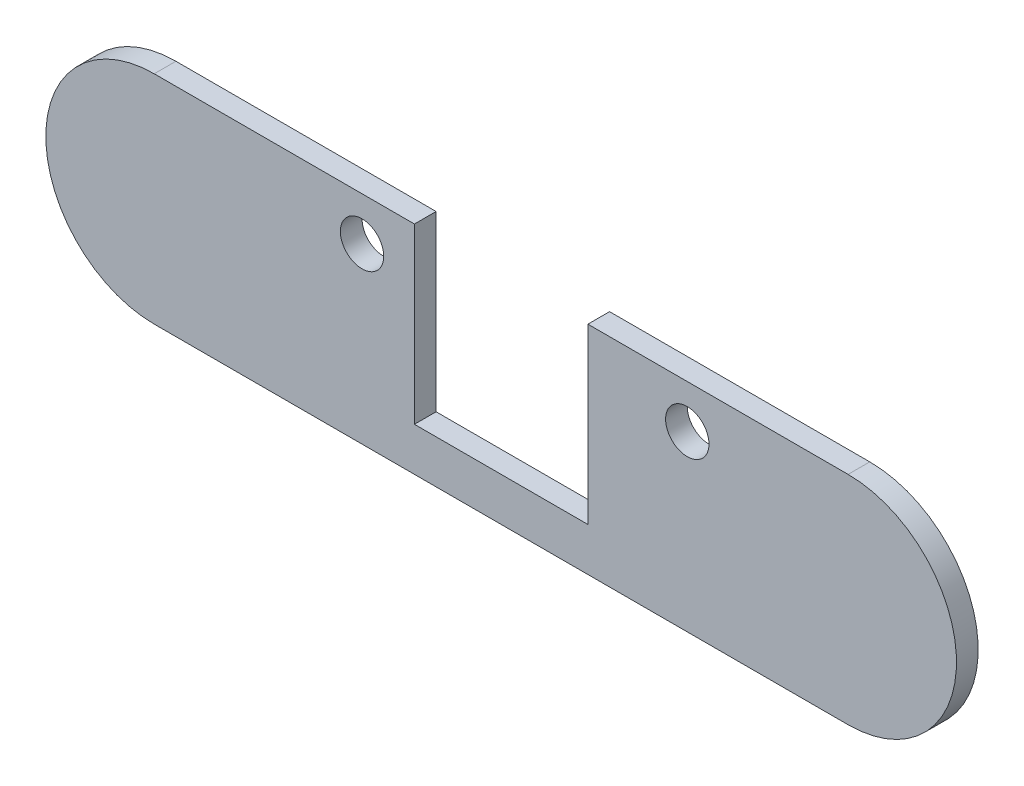
ISO-10303-21;
HEADER;
FILE_DESCRIPTION(('STEP AP214'),'2;1');
FILE_NAME('part.step','',(''),(''),'','','');
FILE_SCHEMA(('AUTOMOTIVE_DESIGN { 1 0 10303 214 1 1 1 1 }'));
ENDSEC;
DATA;
#1=APPLICATION_CONTEXT('core data for automotive mechanical design processes');
#2=APPLICATION_PROTOCOL_DEFINITION('international standard','automotive_design',2000,#1);
#3=PRODUCT_CONTEXT('',#1,'mechanical');
#4=PRODUCT('Part','Part','',(#3));
#5=PRODUCT_RELATED_PRODUCT_CATEGORY('part','',(#4));
#6=PRODUCT_DEFINITION_FORMATION('','',#4);
#7=PRODUCT_DEFINITION_CONTEXT('part definition',#1,'design');
#8=PRODUCT_DEFINITION('design','',#6,#7);
#9=PRODUCT_DEFINITION_SHAPE('','',#8);
#10=(LENGTH_UNIT() NAMED_UNIT(*) SI_UNIT(.MILLI.,.METRE.));
#11=(NAMED_UNIT(*) PLANE_ANGLE_UNIT() SI_UNIT($,.RADIAN.));
#12=(NAMED_UNIT(*) SI_UNIT($,.STERADIAN.) SOLID_ANGLE_UNIT());
#13=UNCERTAINTY_MEASURE_WITH_UNIT(LENGTH_MEASURE(1.E-05),#10,'distance_accuracy_value','');
#14=(GEOMETRIC_REPRESENTATION_CONTEXT(3) GLOBAL_UNCERTAINTY_ASSIGNED_CONTEXT((#13)) GLOBAL_UNIT_ASSIGNED_CONTEXT((#10,
#11,#12)) REPRESENTATION_CONTEXT('',''));
#15=CARTESIAN_POINT('',(0.,0.,0.));
#16=DIRECTION('',(0.,0.,1.));
#17=DIRECTION('',(1.,0.,0.));
#18=AXIS2_PLACEMENT_3D('',#15,#16,#17);
#19=CARTESIAN_POINT('',(0.,25.,5.));
#20=DIRECTION('',(0.,-1.,0.));
#21=DIRECTION('',(0.,0.,-1.));
#22=AXIS2_PLACEMENT_3D('',#19,#20,#21);
#23=PLANE('',#22);
#24=DIRECTION('',(-1.,0.,0.));
#25=VECTOR('',#24,1.);
#26=CARTESIAN_POINT('',(0.,25.,0.));
#27=LINE('',#26,#25);
#28=CARTESIAN_POINT('',(160.,25.,0.));
#29=VERTEX_POINT('',#28);
#30=CARTESIAN_POINT('',(100.,25.,0.));
#31=VERTEX_POINT('',#30);
#32=EDGE_CURVE('E153',#29,#31,#27,.T.);
#33=ORIENTED_EDGE('',*,*,#32,.T.);
#34=DIRECTION('',(0.,0.,1.));
#35=VECTOR('',#34,1.);
#36=CARTESIAN_POINT('',(100.,25.,0.));
#37=LINE('',#36,#35);
#38=CARTESIAN_POINT('',(100.,25.,5.));
#39=VERTEX_POINT('',#38);
#40=EDGE_CURVE('E133',#31,#39,#37,.T.);
#41=ORIENTED_EDGE('',*,*,#40,.T.);
#42=DIRECTION('',(-1.,0.,0.));
#43=VECTOR('',#42,1.);
#44=CARTESIAN_POINT('',(0.,25.,5.));
#45=LINE('',#44,#43);
#46=CARTESIAN_POINT('',(160.,25.,5.));
#47=VERTEX_POINT('',#46);
#48=EDGE_CURVE('E157',#47,#39,#45,.T.);
#49=ORIENTED_EDGE('',*,*,#48,.F.);
#50=DIRECTION('',(0.,0.,-1.));
#51=VECTOR('',#50,1.);
#52=CARTESIAN_POINT('',(160.,25.,5.));
#53=LINE('',#52,#51);
#54=EDGE_CURVE('E170',#47,#29,#53,.T.);
#55=ORIENTED_EDGE('',*,*,#54,.T.);
#56=EDGE_LOOP('',(#33,#41,#49,#55));
#57=FACE_BOUND('',#56,.T.);
#58=ADVANCED_FACE('F32',(#57),#23,.F.);
#59=CARTESIAN_POINT('',(0.,0.,5.));
#60=DIRECTION('',(0.,0.,1.));
#61=DIRECTION('',(1.,0.,0.));
#62=AXIS2_PLACEMENT_3D('',#59,#60,#61);
#63=PLANE('',#62);
#64=DIRECTION('',(0.,1.,0.));
#65=VECTOR('',#64,1.);
#66=CARTESIAN_POINT('',(100.,-15.,5.));
#67=LINE('',#66,#65);
#68=CARTESIAN_POINT('',(100.,-15.,5.));
#69=VERTEX_POINT('',#68);
#70=EDGE_CURVE('E125',#69,#39,#67,.T.);
#71=ORIENTED_EDGE('',*,*,#70,.F.);
#72=DIRECTION('',(1.,0.,0.));
#73=VECTOR('',#72,1.);
#74=CARTESIAN_POINT('',(60.,-15.,5.));
#75=LINE('',#74,#73);
#76=CARTESIAN_POINT('',(60.,-15.,5.));
#77=VERTEX_POINT('',#76);
#78=EDGE_CURVE('E127',#77,#69,#75,.T.);
#79=ORIENTED_EDGE('',*,*,#78,.F.);
#80=DIRECTION('',(0.,-1.,0.));
#81=VECTOR('',#80,1.);
#82=CARTESIAN_POINT('',(60.,25.,5.));
#83=LINE('',#82,#81);
#84=CARTESIAN_POINT('',(60.,25.,5.));
#85=VERTEX_POINT('',#84);
#86=EDGE_CURVE('E107',#85,#77,#83,.T.);
#87=ORIENTED_EDGE('',*,*,#86,.F.);
#88=CARTESIAN_POINT('',(0.,25.,5.));
#89=VERTEX_POINT('',#88);
#90=EDGE_CURVE('E56',#85,#89,#45,.T.);
#91=ORIENTED_EDGE('',*,*,#90,.T.);
#92=CARTESIAN_POINT('',(0.,0.,5.));
#93=DIRECTION('',(0.,0.,1.));
#94=DIRECTION('',(1.,0.,0.));
#95=AXIS2_PLACEMENT_3D('',#92,#93,#94);
#96=CIRCLE('',#95,25.);
#97=CARTESIAN_POINT('',(0.,-25.,5.));
#98=VERTEX_POINT('',#97);
#99=EDGE_CURVE('E151',#89,#98,#96,.T.);
#100=ORIENTED_EDGE('',*,*,#99,.T.);
#101=DIRECTION('',(1.,0.,0.));
#102=VECTOR('',#101,1.);
#103=CARTESIAN_POINT('',(0.,-25.,5.));
#104=LINE('',#103,#102);
#105=CARTESIAN_POINT('',(160.,-25.,5.));
#106=VERTEX_POINT('',#105);
#107=EDGE_CURVE('E84',#98,#106,#104,.T.);
#108=ORIENTED_EDGE('',*,*,#107,.T.);
#109=CARTESIAN_POINT('',(160.,0.,5.));
#110=DIRECTION('',(0.,0.,1.));
#111=DIRECTION('',(1.,0.,0.));
#112=AXIS2_PLACEMENT_3D('',#109,#110,#111);
#113=CIRCLE('',#112,25.);
#114=EDGE_CURVE('E155',#106,#47,#113,.T.);
#115=ORIENTED_EDGE('',*,*,#114,.T.);
#116=ORIENTED_EDGE('',*,*,#48,.T.);
#117=EDGE_LOOP('',(#71,#79,#87,#91,#100,#108,#115,#116));
#118=FACE_BOUND('',#117,.T.);
#119=CARTESIAN_POINT('',(122.919007564522,15.,5.));
#120=DIRECTION('',(0.,0.,1.));
#121=DIRECTION('',(1.,0.,0.));
#122=AXIS2_PLACEMENT_3D('',#119,#120,#121);
#123=CIRCLE('',#122,5.);
#124=CARTESIAN_POINT('',(127.919007564522,15.,5.));
#125=VERTEX_POINT('',#124);
#126=EDGE_CURVE('E145',#125,#125,#123,.T.);
#127=ORIENTED_EDGE('',*,*,#126,.F.);
#128=EDGE_LOOP('',(#127));
#129=FACE_BOUND('',#128,.T.);
#130=CARTESIAN_POINT('',(47.9190075645217,15.,5.));
#131=DIRECTION('',(0.,0.,1.));
#132=DIRECTION('',(1.,0.,0.));
#133=AXIS2_PLACEMENT_3D('',#130,#131,#132);
#134=CIRCLE('',#133,5.);
#135=CARTESIAN_POINT('',(52.9190075645217,15.,5.));
#136=VERTEX_POINT('',#135);
#137=EDGE_CURVE('E139',#136,#136,#134,.T.);
#138=ORIENTED_EDGE('',*,*,#137,.F.);
#139=EDGE_LOOP('',(#138));
#140=FACE_BOUND('',#139,.T.);
#141=ADVANCED_FACE('F182',(#118,#129,#140),#63,.T.);
#142=CARTESIAN_POINT('',(0.,0.,0.));
#143=DIRECTION('',(0.,0.,1.));
#144=DIRECTION('',(1.,0.,0.));
#145=AXIS2_PLACEMENT_3D('',#142,#143,#144);
#146=PLANE('',#145);
#147=DIRECTION('',(1.,0.,0.));
#148=VECTOR('',#147,1.);
#149=CARTESIAN_POINT('',(60.,-15.,0.));
#150=LINE('',#149,#148);
#151=CARTESIAN_POINT('',(60.,-15.,0.));
#152=VERTEX_POINT('',#151);
#153=CARTESIAN_POINT('',(100.,-15.,0.));
#154=VERTEX_POINT('',#153);
#155=EDGE_CURVE('E115',#152,#154,#150,.T.);
#156=ORIENTED_EDGE('',*,*,#155,.T.);
#157=DIRECTION('',(0.,1.,0.));
#158=VECTOR('',#157,1.);
#159=CARTESIAN_POINT('',(100.,-15.,0.));
#160=LINE('',#159,#158);
#161=EDGE_CURVE('E120',#154,#31,#160,.T.);
#162=ORIENTED_EDGE('',*,*,#161,.T.);
#163=ORIENTED_EDGE('',*,*,#32,.F.);
#164=CARTESIAN_POINT('',(160.,0.,0.));
#165=DIRECTION('',(0.,0.,1.));
#166=DIRECTION('',(1.,0.,0.));
#167=AXIS2_PLACEMENT_3D('',#164,#165,#166);
#168=CIRCLE('',#167,25.);
#169=CARTESIAN_POINT('',(160.,-25.,0.));
#170=VERTEX_POINT('',#169);
#171=EDGE_CURVE('E165',#170,#29,#168,.T.);
#172=ORIENTED_EDGE('',*,*,#171,.F.);
#173=DIRECTION('',(1.,0.,0.));
#174=VECTOR('',#173,1.);
#175=CARTESIAN_POINT('',(0.,-25.,0.));
#176=LINE('',#175,#174);
#177=CARTESIAN_POINT('',(0.,-25.,0.));
#178=VERTEX_POINT('',#177);
#179=EDGE_CURVE('E163',#178,#170,#176,.T.);
#180=ORIENTED_EDGE('',*,*,#179,.F.);
#181=CARTESIAN_POINT('',(0.,0.,0.));
#182=DIRECTION('',(0.,0.,1.));
#183=DIRECTION('',(1.,0.,0.));
#184=AXIS2_PLACEMENT_3D('',#181,#182,#183);
#185=CIRCLE('',#184,25.);
#186=CARTESIAN_POINT('',(0.,25.,0.));
#187=VERTEX_POINT('',#186);
#188=EDGE_CURVE('E148',#187,#178,#185,.T.);
#189=ORIENTED_EDGE('',*,*,#188,.F.);
#190=CARTESIAN_POINT('',(60.,25.,0.));
#191=VERTEX_POINT('',#190);
#192=EDGE_CURVE('E77',#191,#187,#27,.T.);
#193=ORIENTED_EDGE('',*,*,#192,.F.);
#194=DIRECTION('',(0.,-1.,0.));
#195=VECTOR('',#194,1.);
#196=CARTESIAN_POINT('',(60.,25.,0.));
#197=LINE('',#196,#195);
#198=EDGE_CURVE('E47',#191,#152,#197,.T.);
#199=ORIENTED_EDGE('',*,*,#198,.T.);
#200=EDGE_LOOP('',(#156,#162,#163,#172,#180,#189,#193,#199));
#201=FACE_BOUND('',#200,.T.);
#202=CARTESIAN_POINT('',(122.919007564522,15.,0.));
#203=DIRECTION('',(0.,0.,1.));
#204=DIRECTION('',(1.,0.,0.));
#205=AXIS2_PLACEMENT_3D('',#202,#203,#204);
#206=CIRCLE('',#205,5.);
#207=CARTESIAN_POINT('',(127.919007564522,15.,0.));
#208=VERTEX_POINT('',#207);
#209=EDGE_CURVE('E142',#208,#208,#206,.T.);
#210=ORIENTED_EDGE('',*,*,#209,.T.);
#211=EDGE_LOOP('',(#210));
#212=FACE_BOUND('',#211,.T.);
#213=CARTESIAN_POINT('',(47.9190075645217,15.,0.));
#214=DIRECTION('',(0.,0.,1.));
#215=DIRECTION('',(1.,0.,0.));
#216=AXIS2_PLACEMENT_3D('',#213,#214,#215);
#217=CIRCLE('',#216,5.);
#218=CARTESIAN_POINT('',(52.9190075645217,15.,0.));
#219=VERTEX_POINT('',#218);
#220=EDGE_CURVE('E136',#219,#219,#217,.T.);
#221=ORIENTED_EDGE('',*,*,#220,.T.);
#222=EDGE_LOOP('',(#221));
#223=FACE_BOUND('',#222,.T.);
#224=ADVANCED_FACE('F122',(#201,#212,#223),#146,.F.);
#225=CARTESIAN_POINT('',(0.,0.,5.));
#226=DIRECTION('',(0.,0.,-1.));
#227=DIRECTION('',(-1.,0.,0.));
#228=AXIS2_PLACEMENT_3D('',#225,#226,#227);
#229=CYLINDRICAL_SURFACE('',#228,25.);
#230=ORIENTED_EDGE('',*,*,#188,.T.);
#231=DIRECTION('',(0.,0.,-1.));
#232=VECTOR('',#231,1.);
#233=CARTESIAN_POINT('',(0.,-25.,5.));
#234=LINE('',#233,#232);
#235=EDGE_CURVE('E11',#98,#178,#234,.T.);
#236=ORIENTED_EDGE('',*,*,#235,.F.);
#237=ORIENTED_EDGE('',*,*,#99,.F.);
#238=DIRECTION('',(0.,0.,-1.));
#239=VECTOR('',#238,1.);
#240=CARTESIAN_POINT('',(0.,25.,5.));
#241=LINE('',#240,#239);
#242=EDGE_CURVE('E160',#89,#187,#241,.T.);
#243=ORIENTED_EDGE('',*,*,#242,.T.);
#244=EDGE_LOOP('',(#230,#236,#237,#243));
#245=FACE_BOUND('',#244,.T.);
#246=ADVANCED_FACE('F34',(#245),#229,.T.);
#247=CARTESIAN_POINT('',(0.,-25.,5.));
#248=DIRECTION('',(0.,1.,0.));
#249=DIRECTION('',(0.,0.,1.));
#250=AXIS2_PLACEMENT_3D('',#247,#248,#249);
#251=PLANE('',#250);
#252=ORIENTED_EDGE('',*,*,#179,.T.);
#253=DIRECTION('',(0.,0.,-1.));
#254=VECTOR('',#253,1.);
#255=CARTESIAN_POINT('',(160.,-25.,5.));
#256=LINE('',#255,#254);
#257=EDGE_CURVE('E40',#106,#170,#256,.T.);
#258=ORIENTED_EDGE('',*,*,#257,.F.);
#259=ORIENTED_EDGE('',*,*,#107,.F.);
#260=ORIENTED_EDGE('',*,*,#235,.T.);
#261=EDGE_LOOP('',(#252,#258,#259,#260));
#262=FACE_BOUND('',#261,.T.);
#263=ADVANCED_FACE('F187',(#262),#251,.F.);
#264=CARTESIAN_POINT('',(160.,0.,5.));
#265=DIRECTION('',(0.,0.,-1.));
#266=DIRECTION('',(-1.,0.,0.));
#267=AXIS2_PLACEMENT_3D('',#264,#265,#266);
#268=CYLINDRICAL_SURFACE('',#267,25.);
#269=ORIENTED_EDGE('',*,*,#171,.T.);
#270=ORIENTED_EDGE('',*,*,#54,.F.);
#271=ORIENTED_EDGE('',*,*,#114,.F.);
#272=ORIENTED_EDGE('',*,*,#257,.T.);
#273=EDGE_LOOP('',(#269,#270,#271,#272));
#274=FACE_BOUND('',#273,.T.);
#275=ADVANCED_FACE('F176',(#274),#268,.T.);
#276=ORIENTED_EDGE('',*,*,#90,.F.);
#277=DIRECTION('',(0.,0.,1.));
#278=VECTOR('',#277,1.);
#279=CARTESIAN_POINT('',(60.,25.,0.));
#280=LINE('',#279,#278);
#281=EDGE_CURVE('E112',#191,#85,#280,.T.);
#282=ORIENTED_EDGE('',*,*,#281,.F.);
#283=ORIENTED_EDGE('',*,*,#192,.T.);
#284=ORIENTED_EDGE('',*,*,#242,.F.);
#285=EDGE_LOOP('',(#276,#282,#283,#284));
#286=FACE_BOUND('',#285,.T.);
#287=ADVANCED_FACE('F193',(#286),#23,.F.);
#288=CARTESIAN_POINT('',(122.919007564522,15.,5.));
#289=DIRECTION('',(0.,0.,-1.));
#290=DIRECTION('',(-1.,0.,0.));
#291=AXIS2_PLACEMENT_3D('',#288,#289,#290);
#292=CYLINDRICAL_SURFACE('',#291,5.);
#293=ORIENTED_EDGE('',*,*,#126,.T.);
#294=EDGE_LOOP('',(#293));
#295=FACE_BOUND('',#294,.T.);
#296=ORIENTED_EDGE('',*,*,#209,.F.);
#297=EDGE_LOOP('',(#296));
#298=FACE_BOUND('',#297,.T.);
#299=ADVANCED_FACE('F203',(#295,#298),#292,.F.);
#300=CARTESIAN_POINT('',(47.9190075645217,15.,5.));
#301=DIRECTION('',(0.,0.,-1.));
#302=DIRECTION('',(-1.,0.,0.));
#303=AXIS2_PLACEMENT_3D('',#300,#301,#302);
#304=CYLINDRICAL_SURFACE('',#303,5.);
#305=ORIENTED_EDGE('',*,*,#137,.T.);
#306=EDGE_LOOP('',(#305));
#307=FACE_BOUND('',#306,.T.);
#308=ORIENTED_EDGE('',*,*,#220,.F.);
#309=EDGE_LOOP('',(#308));
#310=FACE_BOUND('',#309,.T.);
#311=ADVANCED_FACE('F207',(#307,#310),#304,.F.);
#312=CARTESIAN_POINT('',(100.,-15.,0.));
#313=DIRECTION('',(1.,0.,0.));
#314=DIRECTION('',(0.,0.,-1.));
#315=AXIS2_PLACEMENT_3D('',#312,#313,#314);
#316=PLANE('',#315);
#317=ORIENTED_EDGE('',*,*,#70,.T.);
#318=ORIENTED_EDGE('',*,*,#40,.F.);
#319=ORIENTED_EDGE('',*,*,#161,.F.);
#320=DIRECTION('',(0.,0.,1.));
#321=VECTOR('',#320,1.);
#322=CARTESIAN_POINT('',(100.,-15.,0.));
#323=LINE('',#322,#321);
#324=EDGE_CURVE('E111',#154,#69,#323,.T.);
#325=ORIENTED_EDGE('',*,*,#324,.T.);
#326=EDGE_LOOP('',(#317,#318,#319,#325));
#327=FACE_BOUND('',#326,.T.);
#328=ADVANCED_FACE('F213',(#327),#316,.F.);
#329=CARTESIAN_POINT('',(60.,-15.,0.));
#330=DIRECTION('',(0.,-1.,0.));
#331=DIRECTION('',(0.,0.,-1.));
#332=AXIS2_PLACEMENT_3D('',#329,#330,#331);
#333=PLANE('',#332);
#334=ORIENTED_EDGE('',*,*,#78,.T.);
#335=ORIENTED_EDGE('',*,*,#324,.F.);
#336=ORIENTED_EDGE('',*,*,#155,.F.);
#337=DIRECTION('',(0.,0.,1.));
#338=VECTOR('',#337,1.);
#339=CARTESIAN_POINT('',(60.,-15.,0.));
#340=LINE('',#339,#338);
#341=EDGE_CURVE('E104',#152,#77,#340,.T.);
#342=ORIENTED_EDGE('',*,*,#341,.T.);
#343=EDGE_LOOP('',(#334,#335,#336,#342));
#344=FACE_BOUND('',#343,.T.);
#345=ADVANCED_FACE('F116',(#344),#333,.F.);
#346=CARTESIAN_POINT('',(60.,25.,0.));
#347=DIRECTION('',(-1.,0.,0.));
#348=DIRECTION('',(0.,-1.,0.));
#349=AXIS2_PLACEMENT_3D('',#346,#347,#348);
#350=PLANE('',#349);
#351=ORIENTED_EDGE('',*,*,#86,.T.);
#352=ORIENTED_EDGE('',*,*,#341,.F.);
#353=ORIENTED_EDGE('',*,*,#198,.F.);
#354=ORIENTED_EDGE('',*,*,#281,.T.);
#355=EDGE_LOOP('',(#351,#352,#353,#354));
#356=FACE_BOUND('',#355,.T.);
#357=ADVANCED_FACE('F106',(#356),#350,.F.);
#358=CLOSED_SHELL('',(#58,#141,#224,#246,#263,#275,#287,#299,#311,#328,#345,#357));
#359=MANIFOLD_SOLID_BREP('B2',#358);
#360=ADVANCED_BREP_SHAPE_REPRESENTATION('',(#18,#359),#14);
#361=SHAPE_DEFINITION_REPRESENTATION(#9,#360);
ENDSEC;
END-ISO-10303-21;
